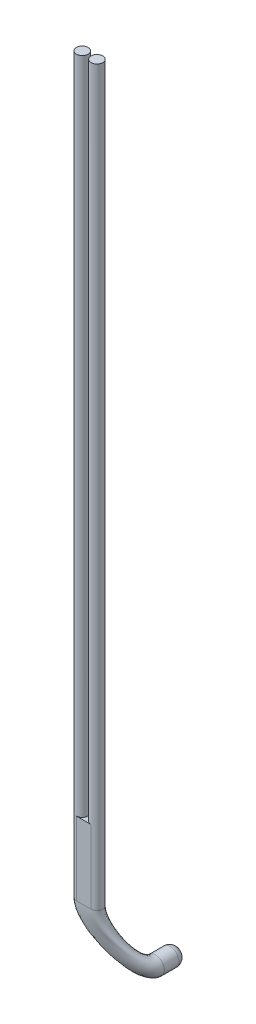
ISO-10303-21;
HEADER;
FILE_DESCRIPTION(('STEP AP214'),'2;1');
FILE_NAME('part.step','',(''),(''),'','','');
FILE_SCHEMA(('AUTOMOTIVE_DESIGN { 1 0 10303 214 1 1 1 1 }'));
ENDSEC;
DATA;
#1=APPLICATION_CONTEXT('core data for automotive mechanical design processes');
#2=APPLICATION_PROTOCOL_DEFINITION('international standard','automotive_design',2000,#1);
#3=PRODUCT_CONTEXT('',#1,'mechanical');
#4=PRODUCT('Part','Part','',(#3));
#5=PRODUCT_RELATED_PRODUCT_CATEGORY('part','',(#4));
#6=PRODUCT_DEFINITION_FORMATION('','',#4);
#7=PRODUCT_DEFINITION_CONTEXT('part definition',#1,'design');
#8=PRODUCT_DEFINITION('design','',#6,#7);
#9=PRODUCT_DEFINITION_SHAPE('','',#8);
#10=(LENGTH_UNIT() NAMED_UNIT(*) SI_UNIT(.MILLI.,.METRE.));
#11=(NAMED_UNIT(*) PLANE_ANGLE_UNIT() SI_UNIT($,.RADIAN.));
#12=(NAMED_UNIT(*) SI_UNIT($,.STERADIAN.) SOLID_ANGLE_UNIT());
#13=UNCERTAINTY_MEASURE_WITH_UNIT(LENGTH_MEASURE(1.E-05),#10,'distance_accuracy_value','');
#14=(GEOMETRIC_REPRESENTATION_CONTEXT(3) GLOBAL_UNCERTAINTY_ASSIGNED_CONTEXT((#13)) GLOBAL_UNIT_ASSIGNED_CONTEXT((#10,
#11,#12)) REPRESENTATION_CONTEXT('',''));
#15=CARTESIAN_POINT('',(0.,0.,0.));
#16=DIRECTION('',(0.,0.,1.));
#17=DIRECTION('',(1.,0.,0.));
#18=AXIS2_PLACEMENT_3D('',#15,#16,#17);
#19=CARTESIAN_POINT('',(0.5,50.,0.));
#20=DIRECTION('',(0.,-1.,0.));
#21=DIRECTION('',(0.,0.,-1.));
#22=AXIS2_PLACEMENT_3D('',#19,#20,#21);
#23=CYLINDRICAL_SURFACE('',#22,0.4);
#24=CARTESIAN_POINT('',(0.5,5.,0.));
#25=DIRECTION('',(0.,1.,0.));
#26=DIRECTION('',(0.,0.,1.));
#27=AXIS2_PLACEMENT_3D('',#24,#25,#26);
#28=CIRCLE('',#27,0.4);
#29=CARTESIAN_POINT('',(0.5,5.,-0.4));
#30=VERTEX_POINT('',#29);
#31=CARTESIAN_POINT('',(0.5,5.,0.4));
#32=VERTEX_POINT('',#31);
#33=EDGE_CURVE('E30',#30,#32,#28,.T.);
#34=ORIENTED_EDGE('',*,*,#33,.T.);
#35=DIRECTION('',(0.,-1.,0.));
#36=VECTOR('',#35,1.);
#37=CARTESIAN_POINT('',(0.5,5.,0.4));
#38=LINE('',#37,#36);
#39=CARTESIAN_POINT('',(0.5,0.,0.4));
#40=VERTEX_POINT('',#39);
#41=EDGE_CURVE('E81',#32,#40,#38,.T.);
#42=ORIENTED_EDGE('',*,*,#41,.T.);
#43=CARTESIAN_POINT('',(0.499999999624838,0.,0.4));
#44=CARTESIAN_POINT('',(0.406096364318613,0.,0.4));
#45=CARTESIAN_POINT('',(0.236773836573353,0.,0.4));
#46=CARTESIAN_POINT('',(0.,0.,0.4));
#47=CARTESIAN_POINT('',(-0.236773836573352,0.,0.4));
#48=CARTESIAN_POINT('',(-0.406096364318613,0.,0.4));
#49=CARTESIAN_POINT('',(-0.594149452020301,0.,0.4));
#50=CARTESIAN_POINT('',(-0.709403805722078,0.,0.360837152415318));
#51=CARTESIAN_POINT('',(-0.840086877999968,0.,0.223367912289751));
#52=CARTESIAN_POINT('',(-0.890825534742676,0.,0.120450006195114));
#53=CARTESIAN_POINT('',(-0.902966985180153,0.,0.));
#54=CARTESIAN_POINT('',(-0.890825534742675,0.,-0.120450006195114));
#55=CARTESIAN_POINT('',(-0.840086877999966,0.,-0.223367912289751));
#56=CARTESIAN_POINT('',(-0.709403805722077,0.,-0.360837152415318));
#57=CARTESIAN_POINT('',(-0.594149452020301,0.,-0.4));
#58=CARTESIAN_POINT('',(-0.406096364318613,0.,-0.4));
#59=CARTESIAN_POINT('',(-0.236773836573353,0.,-0.4));
#60=CARTESIAN_POINT('',(0.,0.,-0.4));
#61=CARTESIAN_POINT('',(0.236773836573353,0.,-0.4));
#62=CARTESIAN_POINT('',(0.406096364318613,0.,-0.4));
#63=CARTESIAN_POINT('',(0.594149452020301,0.,-0.4));
#64=CARTESIAN_POINT('',(0.709403805722078,0.,-0.360837152415319));
#65=CARTESIAN_POINT('',(0.840086877999967,0.,-0.223367912289752));
#66=CARTESIAN_POINT('',(0.890825534742676,0.,-0.120450006195114));
#67=CARTESIAN_POINT('',(0.902966985180154,0.,0.));
#68=CARTESIAN_POINT('',(0.890825534742676,0.,0.120450006195114));
#69=CARTESIAN_POINT('',(0.840086877999968,0.,0.223367912289751));
#70=CARTESIAN_POINT('',(0.709403805722078,0.,0.360837152415319));
#71=CARTESIAN_POINT('',(0.594149452020301,0.,0.4));
#72=CARTESIAN_POINT('',(0.499999999624837,0.,0.4));
#73=B_SPLINE_CURVE_WITH_KNOTS('',3,(#43,#44,#45,#46,#47,#48,#49,#50,#51,#52,#53,#54,#55,#56,#57,
#58,#59,#60,#61,#62,#63,#64,#65,#66,#67,#68,#69,#70,#71,#72),.UNSPECIFIED.,.T.,.F.,(4,1,1,1,2,1,
1,1,1,1,1,1,2,1,1,1,2,1,1,1,1,1,1,1,4),(0.,0.0624183019632111,0.124836603926422,
0.187254905889634,0.249673207852844,0.312254905889634,0.320077618144232,0.361146857480874,
0.374836603926422,0.38852635037197,0.429595589708613,0.437418301963211,0.5,0.562418301963211,
0.624836603926422,0.687254905889633,0.749673207852845,0.812254905889633,0.820077618144232,
0.861146857480875,0.874836603926422,0.88852635037197,0.929595589708612,0.937418301963211,1.),.UNSPECIFIED.);
#74=CARTESIAN_POINT('',(0.5,0.,-0.4));
#75=VERTEX_POINT('',#74);
#76=EDGE_CURVE('E69',#40,#75,#73,.F.);
#77=ORIENTED_EDGE('',*,*,#76,.T.);
#78=DIRECTION('',(0.,-1.,0.));
#79=VECTOR('',#78,1.);
#80=CARTESIAN_POINT('',(0.5,5.,-0.4));
#81=LINE('',#80,#79);
#82=EDGE_CURVE('E42',#30,#75,#81,.T.);
#83=ORIENTED_EDGE('',*,*,#82,.F.);
#84=EDGE_LOOP('',(#34,#42,#77,#83));
#85=FACE_BOUND('',#84,.T.);
#86=CARTESIAN_POINT('',(0.5,50.,0.));
#87=DIRECTION('',(0.,1.,0.));
#88=DIRECTION('',(0.,0.,1.));
#89=AXIS2_PLACEMENT_3D('',#86,#87,#88);
#90=CIRCLE('',#89,0.4);
#91=CARTESIAN_POINT('',(0.5,50.,0.4));
#92=VERTEX_POINT('',#91);
#93=EDGE_CURVE('E251',#92,#92,#90,.T.);
#94=ORIENTED_EDGE('',*,*,#93,.F.);
#95=EDGE_LOOP('',(#94));
#96=FACE_BOUND('',#95,.T.);
#97=ADVANCED_FACE('F21',(#85,#96),#23,.T.);
#98=CARTESIAN_POINT('',(0.5,50.,0.));
#99=DIRECTION('',(0.,1.,0.));
#100=DIRECTION('',(0.,0.,1.));
#101=AXIS2_PLACEMENT_3D('',#98,#99,#100);
#102=PLANE('',#101);
#103=ORIENTED_EDGE('',*,*,#93,.T.);
#104=EDGE_LOOP('',(#103));
#105=FACE_BOUND('',#104,.T.);
#106=ADVANCED_FACE('F104',(#105),#102,.T.);
#107=CARTESIAN_POINT('',(-0.5,5.,0.));
#108=DIRECTION('',(0.,-1.,0.));
#109=DIRECTION('',(0.,0.,-1.));
#110=AXIS2_PLACEMENT_3D('',#107,#108,#109);
#111=CYLINDRICAL_SURFACE('',#110,0.4);
#112=CARTESIAN_POINT('',(0.499999999624838,0.,0.4));
#113=CARTESIAN_POINT('',(0.406096364318613,0.,0.4));
#114=CARTESIAN_POINT('',(0.236773836573353,0.,0.4));
#115=CARTESIAN_POINT('',(0.,0.,0.4));
#116=CARTESIAN_POINT('',(-0.236773836573352,0.,0.4));
#117=CARTESIAN_POINT('',(-0.406096364318613,0.,0.4));
#118=CARTESIAN_POINT('',(-0.594149452020301,0.,0.4));
#119=CARTESIAN_POINT('',(-0.709403805722078,0.,0.360837152415318));
#120=CARTESIAN_POINT('',(-0.840086877999968,0.,0.223367912289751));
#121=CARTESIAN_POINT('',(-0.890825534742676,0.,0.120450006195114));
#122=CARTESIAN_POINT('',(-0.902966985180153,0.,0.));
#123=CARTESIAN_POINT('',(-0.890825534742675,0.,-0.120450006195114));
#124=CARTESIAN_POINT('',(-0.840086877999966,0.,-0.223367912289751));
#125=CARTESIAN_POINT('',(-0.709403805722077,0.,-0.360837152415318));
#126=CARTESIAN_POINT('',(-0.594149452020301,0.,-0.4));
#127=CARTESIAN_POINT('',(-0.406096364318613,0.,-0.4));
#128=CARTESIAN_POINT('',(-0.236773836573353,0.,-0.4));
#129=CARTESIAN_POINT('',(0.,0.,-0.4));
#130=CARTESIAN_POINT('',(0.236773836573353,0.,-0.4));
#131=CARTESIAN_POINT('',(0.406096364318613,0.,-0.4));
#132=CARTESIAN_POINT('',(0.594149452020301,0.,-0.4));
#133=CARTESIAN_POINT('',(0.709403805722078,0.,-0.360837152415319));
#134=CARTESIAN_POINT('',(0.840086877999967,0.,-0.223367912289752));
#135=CARTESIAN_POINT('',(0.890825534742676,0.,-0.120450006195114));
#136=CARTESIAN_POINT('',(0.902966985180154,0.,0.));
#137=CARTESIAN_POINT('',(0.890825534742676,0.,0.120450006195114));
#138=CARTESIAN_POINT('',(0.840086877999968,0.,0.223367912289751));
#139=CARTESIAN_POINT('',(0.709403805722078,0.,0.360837152415319));
#140=CARTESIAN_POINT('',(0.594149452020301,0.,0.4));
#141=CARTESIAN_POINT('',(0.499999999624837,0.,0.4));
#142=B_SPLINE_CURVE_WITH_KNOTS('',3,(#112,#113,#114,#115,#116,#117,#118,#119,#120,#121,#122,
#123,#124,#125,#126,#127,#128,#129,#130,#131,#132,#133,#134,#135,#136,#137,#138,#139,#140,#141),
.UNSPECIFIED.,.T.,.F.,(4,1,1,1,2,1,1,1,1,1,1,1,2,1,1,1,2,1,1,1,1,1,1,1,4),(0.,
0.0624183019632111,0.124836603926422,0.187254905889634,0.249673207852844,0.312254905889634,
0.320077618144232,0.361146857480874,0.374836603926422,0.38852635037197,0.429595589708613,
0.437418301963211,0.5,0.562418301963211,0.624836603926422,0.687254905889633,0.749673207852845,
0.812254905889633,0.820077618144232,0.861146857480875,0.874836603926422,0.88852635037197,
0.929595589708612,0.937418301963211,1.),.UNSPECIFIED.);
#143=CARTESIAN_POINT('',(-0.5,0.,-0.4));
#144=VERTEX_POINT('',#143);
#145=CARTESIAN_POINT('',(-0.5,0.,0.4));
#146=VERTEX_POINT('',#145);
#147=EDGE_CURVE('E66',#144,#146,#142,.F.);
#148=ORIENTED_EDGE('',*,*,#147,.T.);
#149=DIRECTION('',(0.,-1.,0.));
#150=VECTOR('',#149,1.);
#151=CARTESIAN_POINT('',(-0.5,5.,0.4));
#152=LINE('',#151,#150);
#153=CARTESIAN_POINT('',(-0.5,5.,0.4));
#154=VERTEX_POINT('',#153);
#155=EDGE_CURVE('E77',#154,#146,#152,.T.);
#156=ORIENTED_EDGE('',*,*,#155,.F.);
#157=CARTESIAN_POINT('',(-0.5,5.,0.));
#158=DIRECTION('',(0.,1.,0.));
#159=DIRECTION('',(0.,0.,1.));
#160=AXIS2_PLACEMENT_3D('',#157,#158,#159);
#161=CIRCLE('',#160,0.4);
#162=CARTESIAN_POINT('',(-0.5,5.,-0.4));
#163=VERTEX_POINT('',#162);
#164=EDGE_CURVE('E12',#163,#154,#161,.F.);
#165=ORIENTED_EDGE('',*,*,#164,.F.);
#166=DIRECTION('',(0.,-1.,0.));
#167=VECTOR('',#166,1.);
#168=CARTESIAN_POINT('',(-0.5,5.,-0.4));
#169=LINE('',#168,#167);
#170=EDGE_CURVE('E88',#163,#144,#169,.T.);
#171=ORIENTED_EDGE('',*,*,#170,.T.);
#172=EDGE_LOOP('',(#148,#156,#165,#171));
#173=FACE_BOUND('',#172,.T.);
#174=CARTESIAN_POINT('',(-0.5,50.,0.));
#175=DIRECTION('',(0.,1.,0.));
#176=DIRECTION('',(0.,0.,1.));
#177=AXIS2_PLACEMENT_3D('',#174,#175,#176);
#178=CIRCLE('',#177,0.4);
#179=CARTESIAN_POINT('',(-0.5,50.,0.4));
#180=VERTEX_POINT('',#179);
#181=EDGE_CURVE('E89',#180,#180,#178,.T.);
#182=ORIENTED_EDGE('',*,*,#181,.F.);
#183=EDGE_LOOP('',(#182));
#184=FACE_BOUND('',#183,.T.);
#185=ADVANCED_FACE('F85',(#173,#184),#111,.T.);
#186=CARTESIAN_POINT('',(-0.5,5.,0.4));
#187=DIRECTION('',(0.,0.,-1.));
#188=DIRECTION('',(-1.,0.,0.));
#189=AXIS2_PLACEMENT_3D('',#186,#187,#188);
#190=PLANE('',#189);
#191=DIRECTION('',(-1.,0.,0.));
#192=VECTOR('',#191,1.);
#193=CARTESIAN_POINT('',(-0.5,0.,0.4));
#194=LINE('',#193,#192);
#195=EDGE_CURVE('E61',#146,#40,#194,.F.);
#196=ORIENTED_EDGE('',*,*,#195,.T.);
#197=ORIENTED_EDGE('',*,*,#41,.F.);
#198=DIRECTION('',(1.,0.,0.));
#199=VECTOR('',#198,1.);
#200=CARTESIAN_POINT('',(-0.5,5.,0.4));
#201=LINE('',#200,#199);
#202=EDGE_CURVE('E79',#154,#32,#201,.T.);
#203=ORIENTED_EDGE('',*,*,#202,.F.);
#204=ORIENTED_EDGE('',*,*,#155,.T.);
#205=EDGE_LOOP('',(#196,#197,#203,#204));
#206=FACE_BOUND('',#205,.T.);
#207=ADVANCED_FACE('F78',(#206),#190,.F.);
#208=CARTESIAN_POINT('',(-0.5,5.,-0.4));
#209=DIRECTION('',(0.,0.,1.));
#210=DIRECTION('',(1.,0.,0.));
#211=AXIS2_PLACEMENT_3D('',#208,#209,#210);
#212=PLANE('',#211);
#213=DIRECTION('',(1.,0.,0.));
#214=VECTOR('',#213,1.);
#215=CARTESIAN_POINT('',(-0.5,0.,-0.4));
#216=LINE('',#215,#214);
#217=EDGE_CURVE('E73',#75,#144,#216,.F.);
#218=ORIENTED_EDGE('',*,*,#217,.T.);
#219=ORIENTED_EDGE('',*,*,#170,.F.);
#220=DIRECTION('',(-1.,0.,0.));
#221=VECTOR('',#220,1.);
#222=CARTESIAN_POINT('',(-0.5,5.,-0.4));
#223=LINE('',#222,#221);
#224=EDGE_CURVE('E248',#30,#163,#223,.T.);
#225=ORIENTED_EDGE('',*,*,#224,.F.);
#226=ORIENTED_EDGE('',*,*,#82,.T.);
#227=EDGE_LOOP('',(#218,#219,#225,#226));
#228=FACE_BOUND('',#227,.T.);
#229=ADVANCED_FACE('F133',(#228),#212,.F.);
#230=CARTESIAN_POINT('',(-0.5,5.,0.));
#231=DIRECTION('',(0.,1.,0.));
#232=DIRECTION('',(0.,0.,1.));
#233=AXIS2_PLACEMENT_3D('',#230,#231,#232);
#234=PLANE('',#233);
#235=ORIENTED_EDGE('',*,*,#224,.T.);
#236=ORIENTED_EDGE('',*,*,#164,.T.);
#237=ORIENTED_EDGE('',*,*,#202,.T.);
#238=ORIENTED_EDGE('',*,*,#33,.F.);
#239=EDGE_LOOP('',(#235,#236,#237,#238));
#240=FACE_BOUND('',#239,.T.);
#241=ADVANCED_FACE('F142',(#240),#234,.T.);
#242=CARTESIAN_POINT('',(-0.5,50.,0.));
#243=DIRECTION('',(0.,1.,0.));
#244=DIRECTION('',(0.,0.,1.));
#245=AXIS2_PLACEMENT_3D('',#242,#243,#244);
#246=PLANE('',#245);
#247=ORIENTED_EDGE('',*,*,#181,.T.);
#248=EDGE_LOOP('',(#247));
#249=FACE_BOUND('',#248,.T.);
#250=ADVANCED_FACE('F200',(#249),#246,.T.);
#251=CARTESIAN_POINT('',(0.499999999624838,0.,0.4));
#252=CARTESIAN_POINT('',(0.499999999624838,-1.34892239111282,0.4));
#253=CARTESIAN_POINT('',(2.97363051218026,-3.13166029547188,-0.748632314950102));
#254=CARTESIAN_POINT('',(2.97363051218026,-3.13166029547188,-2.));
#255=CARTESIAN_POINT('',(0.406096364318613,0.,0.4));
#256=CARTESIAN_POINT('',(0.406096364318613,-1.38137585668597,0.4));
#257=CARTESIAN_POINT('',(3.02178304051042,-3.1935773420902,-0.723138857091625));
#258=CARTESIAN_POINT('',(3.02178304051042,-3.1935773420902,-2.));
#259=CARTESIAN_POINT('',(0.236773836573353,0.,0.4));
#260=CARTESIAN_POINT('',(0.236773836573353,-1.44863753441825,0.4));
#261=CARTESIAN_POINT('',(3.10078507671901,-3.34594083800302,-0.678134029222471));
#262=CARTESIAN_POINT('',(3.10078507671901,-3.34594083800302,-2.));
#263=CARTESIAN_POINT('',(0.,0.,0.4));
#264=CARTESIAN_POINT('',(0.,-1.55388828519213,0.4));
#265=CARTESIAN_POINT('',(3.10885024491822,-3.63083743042835,-0.609905354942182));
#266=CARTESIAN_POINT('',(3.10885024491822,-3.63083743042835,-2.));
#267=CARTESIAN_POINT('',(-0.236773836573352,0.,0.4));
#268=CARTESIAN_POINT('',(-0.236773836573352,-1.63581571327951,0.4));
#269=CARTESIAN_POINT('',(2.98445747490898,-3.88726978814296,-0.56311287559044));
#270=CARTESIAN_POINT('',(2.98445747490898,-3.88726978814296,-2.));
#271=CARTESIAN_POINT('',(-0.406096364318613,0.,0.4));
#272=CARTESIAN_POINT('',(-0.406096364318613,-1.67011695197798,0.4));
#273=CARTESIAN_POINT('',(2.84983670776261,-3.99372731800725,-0.541131484208349));
#274=CARTESIAN_POINT('',(2.84983670776261,-3.99372731800725,-2.));
#275=CARTESIAN_POINT('',(-0.594149452020301,0.,0.4));
#276=CARTESIAN_POINT('',(-0.594149452020301,-1.69434274357216,0.4));
#277=CARTESIAN_POINT('',(2.71097922492691,-4.06716171096884,-0.529197292480665));
#278=CARTESIAN_POINT('',(2.71097922492691,-4.06716171096884,-2.));
#279=CARTESIAN_POINT('',(-0.709403805722078,0.,0.360837152415318));
#280=CARTESIAN_POINT('',(-0.709403805722078,-1.70227250815019,0.360837152415318));
#281=CARTESIAN_POINT('',(2.63301302203864,-4.08957249712436,-0.52816553296048));
#282=CARTESIAN_POINT('',(2.63301302203864,-4.08957249712436,-2.));
#283=CARTESIAN_POINT('',(-0.840086877999968,0.,0.223367912289751));
#284=CARTESIAN_POINT('',(-0.840086877999968,-1.69583430515628,0.223367912289751));
#285=CARTESIAN_POINT('',(2.51195425783887,-4.10184050077647,-0.554656492184995));
#286=CARTESIAN_POINT('',(2.51195425783887,-4.10184050077647,-2.));
#287=CARTESIAN_POINT('',(-0.890825534742676,0.,0.120450006195114));
#288=CARTESIAN_POINT('',(-0.890825534742676,-1.68552886909884,0.120450006195114));
#289=CARTESIAN_POINT('',(2.44503063761394,-4.09976989631619,-0.578377398801903));
#290=CARTESIAN_POINT('',(2.44503063761394,-4.09976989631619,-2.));
#291=CARTESIAN_POINT('',(-0.902966985180153,0.,0.));
#292=CARTESIAN_POINT('',(-0.902966985180153,-1.66638882671699,0.));
#293=CARTESIAN_POINT('',(2.37380249952067,-4.0871302728432,-0.611895190925679));
#294=CARTESIAN_POINT('',(2.37380249952067,-4.0871302728432,-2.));
#295=CARTESIAN_POINT('',(-0.890825534742675,0.,-0.120450006195114));
#296=CARTESIAN_POINT('',(-0.890825534742675,-1.64334550938482,-0.120450006195114));
#297=CARTESIAN_POINT('',(2.30367524018149,-4.06940295502821,-0.648638086118434));
#298=CARTESIAN_POINT('',(2.30367524018149,-4.06940295502821,-2.));
#299=CARTESIAN_POINT('',(-0.840086877999966,0.,-0.223367912289751));
#300=CARTESIAN_POINT('',(-0.840086877999966,-1.61626113702779,-0.223367912289751));
#301=CARTESIAN_POINT('',(2.2418316929523,-4.04380890701584,-0.686000270763443));
#302=CARTESIAN_POINT('',(2.2418316929523,-4.04380890701584,-2.));
#303=CARTESIAN_POINT('',(-0.709403805722077,0.,-0.360837152415318));
#304=CARTESIAN_POINT('',(-0.709403805722077,-1.56330032984092,-0.360837152415318));
#305=CARTESIAN_POINT('',(2.13652695621432,-3.98289563663888,-0.749259643882901));
#306=CARTESIAN_POINT('',(2.13652695621432,-3.98289563663888,-2.));
#307=CARTESIAN_POINT('',(-0.594149452020301,0.,-0.4));
#308=CARTESIAN_POINT('',(-0.594149452020301,-1.52694548133025,-0.4));
#309=CARTESIAN_POINT('',(2.07464806786573,-3.93041883505431,-0.782478039944553));
#310=CARTESIAN_POINT('',(2.07464806786573,-3.93041883505431,-2.));
#311=CARTESIAN_POINT('',(-0.406096364318613,0.,-0.4));
#312=CARTESIAN_POINT('',(-0.406096364318613,-1.46047349111308,-0.4));
#313=CARTESIAN_POINT('',(1.97821695948958,-3.8064226579098,-0.835011795109324));
#314=CARTESIAN_POINT('',(1.97821695948958,-3.8064226579098,-2.));
#315=CARTESIAN_POINT('',(-0.236773836573353,0.,-0.4));
#316=CARTESIAN_POINT('',(-0.236773836573353,-1.39217040725727,-0.4));
#317=CARTESIAN_POINT('',(1.89921492328099,-3.65405916199698,-0.881058029102007));
#318=CARTESIAN_POINT('',(1.89921492328099,-3.65405916199698,-2.));
#319=CARTESIAN_POINT('',(0.,0.,-0.4));
#320=CARTESIAN_POINT('',(0.,-1.28531167755774,-0.4));
#321=CARTESIAN_POINT('',(1.89114975508178,-3.36916256957165,-0.950894682307944));
#322=CARTESIAN_POINT('',(1.89114975508178,-3.36916256957165,-2.));
#323=CARTESIAN_POINT('',(0.236773836573353,0.,-0.4));
#324=CARTESIAN_POINT('',(0.236773836573353,-1.20051690023138,-0.4));
#325=CARTESIAN_POINT('',(2.01554252509102,-3.11273021185705,-1.00055451089868));
#326=CARTESIAN_POINT('',(2.01554252509102,-3.11273021185705,-2.));
#327=CARTESIAN_POINT('',(0.406096364318613,0.,-0.4));
#328=CARTESIAN_POINT('',(0.406096364318613,-1.16528240395699,-0.4));
#329=CARTESIAN_POINT('',(2.15016329223739,-3.00627268199275,-1.02346915985668));
#330=CARTESIAN_POINT('',(2.15016329223739,-3.00627268199275,-2.));
#331=CARTESIAN_POINT('',(0.594149452020301,0.,-0.4));
#332=CARTESIAN_POINT('',(0.594149452020301,-1.14105591313433,-0.4));
#333=CARTESIAN_POINT('',(2.28902077507309,-2.93283828903117,-1.03540405081284));
#334=CARTESIAN_POINT('',(2.28902077507309,-2.93283828903117,-2.));
#335=CARTESIAN_POINT('',(0.709403805722078,0.,-0.360837152415319));
#336=CARTESIAN_POINT('',(0.709403805722078,-1.13365306927275,-0.360837152415319));
#337=CARTESIAN_POINT('',(2.36698697796136,-2.91042750287565,-1.03590888961659));
#338=CARTESIAN_POINT('',(2.36698697796136,-2.91042750287565,-2.));
#339=CARTESIAN_POINT('',(0.840086877999967,0.,-0.223367912289752));
#340=CARTESIAN_POINT('',(0.840086877999967,-1.14191407693681,-0.223367912289752));
#341=CARTESIAN_POINT('',(2.48804574216113,-2.89815949922354,-1.00759512572191));
#342=CARTESIAN_POINT('',(2.48804574216113,-2.89815949922354,-2.));
#343=CARTESIAN_POINT('',(0.890825534742676,0.,-0.120450006195114));
#344=CARTESIAN_POINT('',(0.890825534742676,-1.15373302930977,-0.120450006195114));
#345=CARTESIAN_POINT('',(2.55496936238606,-2.90023010368381,-0.982360702789496));
#346=CARTESIAN_POINT('',(2.55496936238606,-2.90023010368381,-2.));
#347=CARTESIAN_POINT('',(0.902966985180154,0.,0.));
#348=CARTESIAN_POINT('',(0.902966985180154,-1.17459550821145,0.));
#349=CARTESIAN_POINT('',(2.62619750047933,-2.91286972715681,-0.947120474145884));
#350=CARTESIAN_POINT('',(2.62619750047933,-2.91286972715681,-2.));
#351=CARTESIAN_POINT('',(0.890825534742676,0.,0.120450006195114));
#352=CARTESIAN_POINT('',(0.890825534742676,-1.19919482259042,0.120450006195114));
#353=CARTESIAN_POINT('',(2.69632475981851,-2.93059704497179,-0.908821581906333));
#354=CARTESIAN_POINT('',(2.69632475981851,-2.93059704497179,-2.));
#355=CARTESIAN_POINT('',(0.840086877999968,0.,0.223367912289751));
#356=CARTESIAN_POINT('',(0.840086877999968,-1.2273790262152,0.223367912289751));
#357=CARTESIAN_POINT('',(2.7581683070477,-2.95619109298416,-0.870359565993567));
#358=CARTESIAN_POINT('',(2.7581683070477,-2.95619109298416,-2.));
#359=CARTESIAN_POINT('',(0.709403805722078,0.,0.360837152415319));
#360=CARTESIAN_POINT('',(0.709403805722078,-1.281109735356,0.360837152415319));
#361=CARTESIAN_POINT('',(2.86347304378568,-3.01710436336112,-0.806330290920178));
#362=CARTESIAN_POINT('',(2.86347304378568,-3.01710436336112,-2.));
#363=CARTESIAN_POINT('',(0.594149452020301,0.,0.4));
#364=CARTESIAN_POINT('',(0.594149452020301,-1.31638397018712,0.4));
#365=CARTESIAN_POINT('',(2.92535193213426,-3.06958116494569,-0.774192508538084));
#366=CARTESIAN_POINT('',(2.92535193213426,-3.06958116494569,-2.));
#367=CARTESIAN_POINT('',(0.499999999624838,0.,0.4));
#368=CARTESIAN_POINT('',(0.499999999624838,-1.34892239111282,0.4));
#369=CARTESIAN_POINT('',(2.97363051218026,-3.13166029547188,-0.748632314950102));
#370=CARTESIAN_POINT('',(2.97363051218026,-3.13166029547188,-2.));
#371=B_SPLINE_SURFACE_WITH_KNOTS('',3,3,((#251,#252,#253,#254),(#255,#256,#257,#258),(#259,#260,
#261,#262),(#263,#264,#265,#266),(#267,#268,#269,#270),(#271,#272,#273,#274),(#275,#276,#277,
#278),(#279,#280,#281,#282),(#283,#284,#285,#286),(#287,#288,#289,#290),(#291,#292,#293,#294),
(#295,#296,#297,#298),(#299,#300,#301,#302),(#303,#304,#305,#306),(#307,#308,#309,#310),(#311,
#312,#313,#314),(#315,#316,#317,#318),(#319,#320,#321,#322),(#323,#324,#325,#326),(#327,#328,
#329,#330),(#331,#332,#333,#334),(#335,#336,#337,#338),(#339,#340,#341,#342),(#343,#344,#345,
#346),(#347,#348,#349,#350),(#351,#352,#353,#354),(#355,#356,#357,#358),(#359,#360,#361,#362),
(#363,#364,#365,#366),(#367,#368,#369,#370)),.UNSPECIFIED.,.T.,.F.,.F.,(4,1,1,1,2,1,1,1,1,1,1,1,
2,1,1,1,2,1,1,1,1,1,1,1,4),(4,4),(0.,0.0624183019632111,0.124836603926422,0.187254905889634,
0.249673207852844,0.312254905889634,0.320077618144232,0.361146857480874,0.374836603926422,
0.38852635037197,0.429595589708613,0.437418301963211,0.5,0.562418301963211,0.624836603926422,
0.687254905889633,0.749673207852845,0.812254905889633,0.820077618144232,0.861146857480875,
0.874836603926422,0.88852635037197,0.929595589708612,0.937418301963211,1.),(0.,1.),.UNSPECIFIED.);
#372=CARTESIAN_POINT('',(2.97363051218026,-3.13166029547188,-2.));
#373=CARTESIAN_POINT('',(2.92535193213426,-3.06958116494569,-2.));
#374=CARTESIAN_POINT('',(2.86347304378568,-3.01710436336112,-2.));
#375=CARTESIAN_POINT('',(2.7581683070477,-2.95619109298416,-2.));
#376=CARTESIAN_POINT('',(2.69632475981851,-2.93059704497179,-2.));
#377=CARTESIAN_POINT('',(2.62619750047933,-2.91286972715681,-2.));
#378=CARTESIAN_POINT('',(2.55496936238606,-2.90023010368381,-2.));
#379=CARTESIAN_POINT('',(2.48804574216113,-2.89815949922354,-2.));
#380=CARTESIAN_POINT('',(2.36698697796136,-2.91042750287565,-2.));
#381=CARTESIAN_POINT('',(2.28902077507309,-2.93283828903117,-2.));
#382=CARTESIAN_POINT('',(2.15016329223739,-3.00627268199275,-2.));
#383=CARTESIAN_POINT('',(2.01554252509102,-3.11273021185705,-2.));
#384=CARTESIAN_POINT('',(1.89114975508178,-3.36916256957165,-2.));
#385=CARTESIAN_POINT('',(1.89921492328099,-3.65405916199698,-2.));
#386=CARTESIAN_POINT('',(1.97821695948958,-3.8064226579098,-2.));
#387=CARTESIAN_POINT('',(2.07464806786573,-3.93041883505431,-2.));
#388=CARTESIAN_POINT('',(2.13652695621432,-3.98289563663888,-2.));
#389=CARTESIAN_POINT('',(2.2418316929523,-4.04380890701584,-2.));
#390=CARTESIAN_POINT('',(2.30367524018149,-4.06940295502821,-2.));
#391=CARTESIAN_POINT('',(2.37380249952067,-4.0871302728432,-2.));
#392=CARTESIAN_POINT('',(2.44503063761394,-4.09976989631619,-2.));
#393=CARTESIAN_POINT('',(2.51195425783887,-4.10184050077647,-2.));
#394=CARTESIAN_POINT('',(2.63301302203864,-4.08957249712436,-2.));
#395=CARTESIAN_POINT('',(2.71097922492691,-4.06716171096884,-2.));
#396=CARTESIAN_POINT('',(2.84983670776261,-3.99372731800725,-2.));
#397=CARTESIAN_POINT('',(2.98445747490898,-3.88726978814296,-2.));
#398=CARTESIAN_POINT('',(3.10885024491822,-3.63083743042835,-2.));
#399=CARTESIAN_POINT('',(3.10078507671901,-3.34594083800302,-2.));
#400=CARTESIAN_POINT('',(3.02178304051042,-3.1935773420902,-2.));
#401=CARTESIAN_POINT('',(2.97363051218026,-3.13166029547188,-2.));
#402=B_SPLINE_CURVE_WITH_KNOTS('',3,(#372,#373,#374,#375,#376,#377,#378,#379,#380,#381,#382,
#383,#384,#385,#386,#387,#388,#389,#390,#391,#392,#393,#394,#395,#396,#397,#398,#399,#400,#401),
.UNSPECIFIED.,.T.,.F.,(4,1,1,1,1,1,1,1,2,1,1,1,2,1,1,1,1,1,1,1,2,1,1,1,4),(0.,0.062581698036789,
0.070404410291388,0.11147364962803,0.125163396073578,0.138853142519125,0.179922381855768,
0.187745094110367,0.250326792147155,0.312745094110367,0.375163396073578,0.437581698036789,0.5,
0.562581698036789,0.570404410291387,0.61147364962803,0.625163396073578,0.638853142519126,
0.679922381855768,0.687745094110366,0.750326792147155,0.812745094110366,0.875163396073578,
0.937581698036789,1.),.UNSPECIFIED.);
#403=CARTESIAN_POINT('',(2.97363051218026,-3.13166029547188,-2.));
#404=VERTEX_POINT('',#403);
#405=EDGE_CURVE('E235',#404,#404,#402,.T.);
#406=ORIENTED_EDGE('',*,*,#195,.F.);
#407=ORIENTED_EDGE('',*,*,#147,.F.);
#408=ORIENTED_EDGE('',*,*,#217,.F.);
#409=ORIENTED_EDGE('',*,*,#76,.F.);
#410=EDGE_LOOP('',(#406,#407,#408,#409));
#411=FACE_BOUND('',#410,.T.);
#412=ORIENTED_EDGE('',*,*,#405,.T.);
#413=EDGE_LOOP('',(#412));
#414=FACE_BOUND('',#413,.T.);
#415=ADVANCED_FACE('F63',(#411,#414),#371,.T.);
#416=CARTESIAN_POINT('',(2.5,-3.5,-3.5));
#417=DIRECTION('',(0.,0.,1.));
#418=DIRECTION('',(1.,0.,0.));
#419=AXIS2_PLACEMENT_3D('',#416,#417,#418);
#420=CYLINDRICAL_SURFACE('',#419,0.6);
#421=CARTESIAN_POINT('',(2.5,-3.5,-3.));
#422=DIRECTION('',(0.,0.,1.));
#423=DIRECTION('',(1.,0.,0.));
#424=AXIS2_PLACEMENT_3D('',#421,#422,#423);
#425=CIRCLE('',#424,0.6);
#426=CARTESIAN_POINT('',(3.1,-3.5,-3.));
#427=VERTEX_POINT('',#426);
#428=EDGE_CURVE('E367',#427,#427,#425,.T.);
#429=ORIENTED_EDGE('',*,*,#428,.T.);
#430=EDGE_LOOP('',(#429));
#431=FACE_BOUND('',#430,.T.);
#432=ORIENTED_EDGE('',*,*,#405,.F.);
#433=EDGE_LOOP('',(#432));
#434=FACE_BOUND('',#433,.T.);
#435=ADVANCED_FACE('F210',(#431,#434),#420,.T.);
#436=CARTESIAN_POINT('',(2.5,-3.5,-3.5));
#437=DIRECTION('',(0.,0.,1.));
#438=DIRECTION('',(1.,0.,0.));
#439=AXIS2_PLACEMENT_3D('',#436,#437,#438);
#440=PLANE('',#439);
#441=CARTESIAN_POINT('',(2.5,-3.5,-3.5));
#442=DIRECTION('',(0.,0.,1.));
#443=DIRECTION('',(1.,0.,0.));
#444=AXIS2_PLACEMENT_3D('',#441,#442,#443);
#445=CIRCLE('',#444,0.1);
#446=CARTESIAN_POINT('',(2.6,-3.5,-3.5));
#447=VERTEX_POINT('',#446);
#448=EDGE_CURVE('E246',#447,#447,#445,.F.);
#449=ORIENTED_EDGE('',*,*,#448,.T.);
#450=EDGE_LOOP('',(#449));
#451=FACE_BOUND('',#450,.T.);
#452=ADVANCED_FACE('F327',(#451),#440,.F.);
#453=CARTESIAN_POINT('',(2.5,-3.5,-3.));
#454=DIRECTION('',(0.,0.,1.));
#455=DIRECTION('',(1.,0.,0.));
#456=AXIS2_PLACEMENT_3D('',#453,#454,#455);
#457=DEGENERATE_TOROIDAL_SURFACE('',#456,0.1,0.5,.T.);
#458=ORIENTED_EDGE('',*,*,#448,.F.);
#459=EDGE_LOOP('',(#458));
#460=FACE_BOUND('',#459,.T.);
#461=ORIENTED_EDGE('',*,*,#428,.F.);
#462=EDGE_LOOP('',(#461));
#463=FACE_BOUND('',#462,.T.);
#464=ADVANCED_FACE('F211',(#460,#463),#457,.T.);
#465=CLOSED_SHELL('',(#97,#106,#185,#207,#229,#241,#250,#415,#435,#452,#464));
#466=MANIFOLD_SOLID_BREP('B1',#465);
#467=ADVANCED_BREP_SHAPE_REPRESENTATION('',(#18,#466),#14);
#468=SHAPE_DEFINITION_REPRESENTATION(#9,#467);
ENDSEC;
END-ISO-10303-21;
